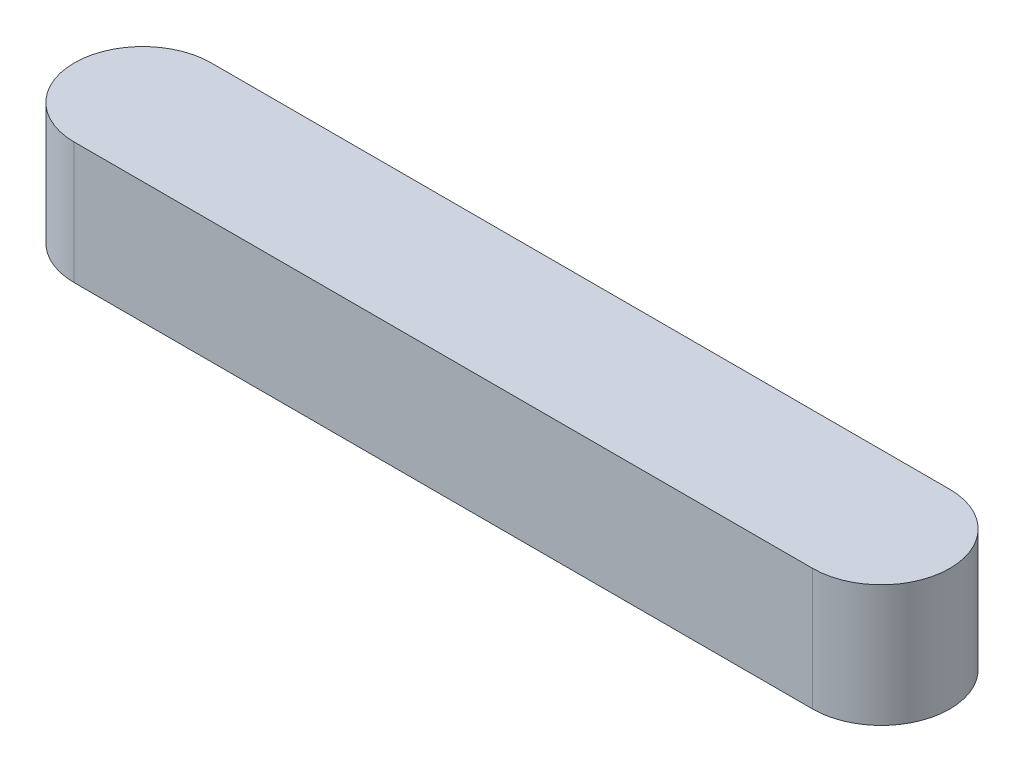
ISO-10303-21;
HEADER;
FILE_DESCRIPTION(('STEP AP214'),'2;1');
FILE_NAME('part.step','',(''),(''),'','','');
FILE_SCHEMA(('AUTOMOTIVE_DESIGN { 1 0 10303 214 1 1 1 1 }'));
ENDSEC;
DATA;
#1=APPLICATION_CONTEXT('core data for automotive mechanical design processes');
#2=APPLICATION_PROTOCOL_DEFINITION('international standard','automotive_design',2000,#1);
#3=PRODUCT_CONTEXT('',#1,'mechanical');
#4=PRODUCT('Part','Part','',(#3));
#5=PRODUCT_RELATED_PRODUCT_CATEGORY('part','',(#4));
#6=PRODUCT_DEFINITION_FORMATION('','',#4);
#7=PRODUCT_DEFINITION_CONTEXT('part definition',#1,'design');
#8=PRODUCT_DEFINITION('design','',#6,#7);
#9=PRODUCT_DEFINITION_SHAPE('','',#8);
#10=(LENGTH_UNIT() NAMED_UNIT(*) SI_UNIT(.MILLI.,.METRE.));
#11=(NAMED_UNIT(*) PLANE_ANGLE_UNIT() SI_UNIT($,.RADIAN.));
#12=(NAMED_UNIT(*) SI_UNIT($,.STERADIAN.) SOLID_ANGLE_UNIT());
#13=UNCERTAINTY_MEASURE_WITH_UNIT(LENGTH_MEASURE(1.E-05),#10,'distance_accuracy_value','');
#14=(GEOMETRIC_REPRESENTATION_CONTEXT(3) GLOBAL_UNCERTAINTY_ASSIGNED_CONTEXT((#13)) GLOBAL_UNIT_ASSIGNED_CONTEXT((#10,
#11,#12)) REPRESENTATION_CONTEXT('',''));
#15=CARTESIAN_POINT('',(0.,0.,0.));
#16=DIRECTION('',(0.,0.,1.));
#17=DIRECTION('',(1.,0.,0.));
#18=AXIS2_PLACEMENT_3D('',#15,#16,#17);
#19=CARTESIAN_POINT('',(-48.5,16.,0.));
#20=DIRECTION('',(0.,-1.,0.));
#21=DIRECTION('',(0.,0.,-1.));
#22=AXIS2_PLACEMENT_3D('',#19,#20,#21);
#23=CYLINDRICAL_SURFACE('',#22,9.00000000000002);
#24=CARTESIAN_POINT('',(-48.5,0.,0.));
#25=DIRECTION('',(0.,1.,0.));
#26=DIRECTION('',(0.,0.,1.));
#27=AXIS2_PLACEMENT_3D('',#24,#25,#26);
#28=CIRCLE('',#27,9.00000000000002);
#29=CARTESIAN_POINT('',(-48.5,0.,-9.00000000000002));
#30=VERTEX_POINT('',#29);
#31=CARTESIAN_POINT('',(-48.5,0.,9.00000000000002));
#32=VERTEX_POINT('',#31);
#33=EDGE_CURVE('E99',#30,#32,#28,.T.);
#34=ORIENTED_EDGE('',*,*,#33,.T.);
#35=DIRECTION('',(0.,-1.,0.));
#36=VECTOR('',#35,1.);
#37=CARTESIAN_POINT('',(-48.5,16.,9.00000000000002));
#38=LINE('',#37,#36);
#39=CARTESIAN_POINT('',(-48.5,16.,9.00000000000002));
#40=VERTEX_POINT('',#39);
#41=EDGE_CURVE('E11',#40,#32,#38,.T.);
#42=ORIENTED_EDGE('',*,*,#41,.F.);
#43=CARTESIAN_POINT('',(-48.5,16.,0.));
#44=DIRECTION('',(0.,1.,0.));
#45=DIRECTION('',(0.,0.,1.));
#46=AXIS2_PLACEMENT_3D('',#43,#44,#45);
#47=CIRCLE('',#46,9.00000000000002);
#48=CARTESIAN_POINT('',(-48.5,16.,-9.00000000000002));
#49=VERTEX_POINT('',#48);
#50=EDGE_CURVE('E86',#49,#40,#47,.T.);
#51=ORIENTED_EDGE('',*,*,#50,.F.);
#52=DIRECTION('',(0.,-1.,0.));
#53=VECTOR('',#52,1.);
#54=CARTESIAN_POINT('',(-48.5,16.,-9.00000000000002));
#55=LINE('',#54,#53);
#56=EDGE_CURVE('E96',#49,#30,#55,.T.);
#57=ORIENTED_EDGE('',*,*,#56,.T.);
#58=EDGE_LOOP('',(#34,#42,#51,#57));
#59=FACE_BOUND('',#58,.T.);
#60=ADVANCED_FACE('F40',(#59),#23,.T.);
#61=CARTESIAN_POINT('',(-48.5,16.,9.00000000000002));
#62=DIRECTION('',(0.,0.,-1.));
#63=DIRECTION('',(-1.,0.,0.));
#64=AXIS2_PLACEMENT_3D('',#61,#62,#63);
#65=PLANE('',#64);
#66=DIRECTION('',(1.,0.,0.));
#67=VECTOR('',#66,1.);
#68=CARTESIAN_POINT('',(-48.5,0.,9.00000000000002));
#69=LINE('',#68,#67);
#70=CARTESIAN_POINT('',(48.5,0.,9.));
#71=VERTEX_POINT('',#70);
#72=EDGE_CURVE('E95',#32,#71,#69,.T.);
#73=ORIENTED_EDGE('',*,*,#72,.T.);
#74=DIRECTION('',(0.,-1.,0.));
#75=VECTOR('',#74,1.);
#76=CARTESIAN_POINT('',(48.5,16.,9.));
#77=LINE('',#76,#75);
#78=CARTESIAN_POINT('',(48.5,16.,9.));
#79=VERTEX_POINT('',#78);
#80=EDGE_CURVE('E44',#79,#71,#77,.T.);
#81=ORIENTED_EDGE('',*,*,#80,.F.);
#82=DIRECTION('',(1.,0.,0.));
#83=VECTOR('',#82,1.);
#84=CARTESIAN_POINT('',(-48.5,16.,9.00000000000002));
#85=LINE('',#84,#83);
#86=EDGE_CURVE('E81',#40,#79,#85,.T.);
#87=ORIENTED_EDGE('',*,*,#86,.F.);
#88=ORIENTED_EDGE('',*,*,#41,.T.);
#89=EDGE_LOOP('',(#73,#81,#87,#88));
#90=FACE_BOUND('',#89,.T.);
#91=ADVANCED_FACE('F93',(#90),#65,.F.);
#92=CARTESIAN_POINT('',(48.5,16.,0.));
#93=DIRECTION('',(0.,-1.,0.));
#94=DIRECTION('',(0.,0.,-1.));
#95=AXIS2_PLACEMENT_3D('',#92,#93,#94);
#96=CYLINDRICAL_SURFACE('',#95,9.00000000000002);
#97=CARTESIAN_POINT('',(48.5,0.,0.));
#98=DIRECTION('',(0.,1.,0.));
#99=DIRECTION('',(0.,0.,1.));
#100=AXIS2_PLACEMENT_3D('',#97,#98,#99);
#101=CIRCLE('',#100,9.00000000000002);
#102=CARTESIAN_POINT('',(48.5,0.,-9.00000000000003));
#103=VERTEX_POINT('',#102);
#104=EDGE_CURVE('E68',#71,#103,#101,.T.);
#105=ORIENTED_EDGE('',*,*,#104,.T.);
#106=DIRECTION('',(0.,-1.,0.));
#107=VECTOR('',#106,1.);
#108=CARTESIAN_POINT('',(48.5,16.,-9.00000000000003));
#109=LINE('',#108,#107);
#110=CARTESIAN_POINT('',(48.5,16.,-9.00000000000003));
#111=VERTEX_POINT('',#110);
#112=EDGE_CURVE('E91',#111,#103,#109,.T.);
#113=ORIENTED_EDGE('',*,*,#112,.F.);
#114=CARTESIAN_POINT('',(48.5,16.,0.));
#115=DIRECTION('',(0.,1.,0.));
#116=DIRECTION('',(0.,0.,1.));
#117=AXIS2_PLACEMENT_3D('',#114,#115,#116);
#118=CIRCLE('',#117,9.00000000000002);
#119=EDGE_CURVE('E88',#79,#111,#118,.T.);
#120=ORIENTED_EDGE('',*,*,#119,.F.);
#121=ORIENTED_EDGE('',*,*,#80,.T.);
#122=EDGE_LOOP('',(#105,#113,#120,#121));
#123=FACE_BOUND('',#122,.T.);
#124=ADVANCED_FACE('F94',(#123),#96,.T.);
#125=CARTESIAN_POINT('',(-48.5,16.,-9.00000000000002));
#126=DIRECTION('',(0.,0.,1.));
#127=DIRECTION('',(1.,0.,0.));
#128=AXIS2_PLACEMENT_3D('',#125,#126,#127);
#129=PLANE('',#128);
#130=DIRECTION('',(-1.,0.,0.));
#131=VECTOR('',#130,1.);
#132=CARTESIAN_POINT('',(-48.5,0.,-9.00000000000002));
#133=LINE('',#132,#131);
#134=EDGE_CURVE('E77',#103,#30,#133,.T.);
#135=ORIENTED_EDGE('',*,*,#134,.T.);
#136=ORIENTED_EDGE('',*,*,#56,.F.);
#137=DIRECTION('',(-1.,0.,0.));
#138=VECTOR('',#137,1.);
#139=CARTESIAN_POINT('',(-48.5,16.,-9.00000000000002));
#140=LINE('',#139,#138);
#141=EDGE_CURVE('E52',#111,#49,#140,.T.);
#142=ORIENTED_EDGE('',*,*,#141,.F.);
#143=ORIENTED_EDGE('',*,*,#112,.T.);
#144=EDGE_LOOP('',(#135,#136,#142,#143));
#145=FACE_BOUND('',#144,.T.);
#146=ADVANCED_FACE('F110',(#145),#129,.F.);
#147=CARTESIAN_POINT('',(-48.5,16.,0.));
#148=DIRECTION('',(0.,1.,0.));
#149=DIRECTION('',(0.,0.,1.));
#150=AXIS2_PLACEMENT_3D('',#147,#148,#149);
#151=PLANE('',#150);
#152=ORIENTED_EDGE('',*,*,#50,.T.);
#153=ORIENTED_EDGE('',*,*,#86,.T.);
#154=ORIENTED_EDGE('',*,*,#119,.T.);
#155=ORIENTED_EDGE('',*,*,#141,.T.);
#156=EDGE_LOOP('',(#152,#153,#154,#155));
#157=FACE_BOUND('',#156,.T.);
#158=ADVANCED_FACE('F84',(#157),#151,.T.);
#159=CARTESIAN_POINT('',(-48.5,0.,0.));
#160=DIRECTION('',(0.,1.,0.));
#161=DIRECTION('',(0.,0.,1.));
#162=AXIS2_PLACEMENT_3D('',#159,#160,#161);
#163=PLANE('',#162);
#164=ORIENTED_EDGE('',*,*,#33,.F.);
#165=ORIENTED_EDGE('',*,*,#134,.F.);
#166=ORIENTED_EDGE('',*,*,#104,.F.);
#167=ORIENTED_EDGE('',*,*,#72,.F.);
#168=EDGE_LOOP('',(#164,#165,#166,#167));
#169=FACE_BOUND('',#168,.T.);
#170=ADVANCED_FACE('F109',(#169),#163,.F.);
#171=CLOSED_SHELL('',(#60,#91,#124,#146,#158,#170));
#172=MANIFOLD_SOLID_BREP('B2',#171);
#173=ADVANCED_BREP_SHAPE_REPRESENTATION('',(#18,#172),#14);
#174=SHAPE_DEFINITION_REPRESENTATION(#9,#173);
ENDSEC;
END-ISO-10303-21;
